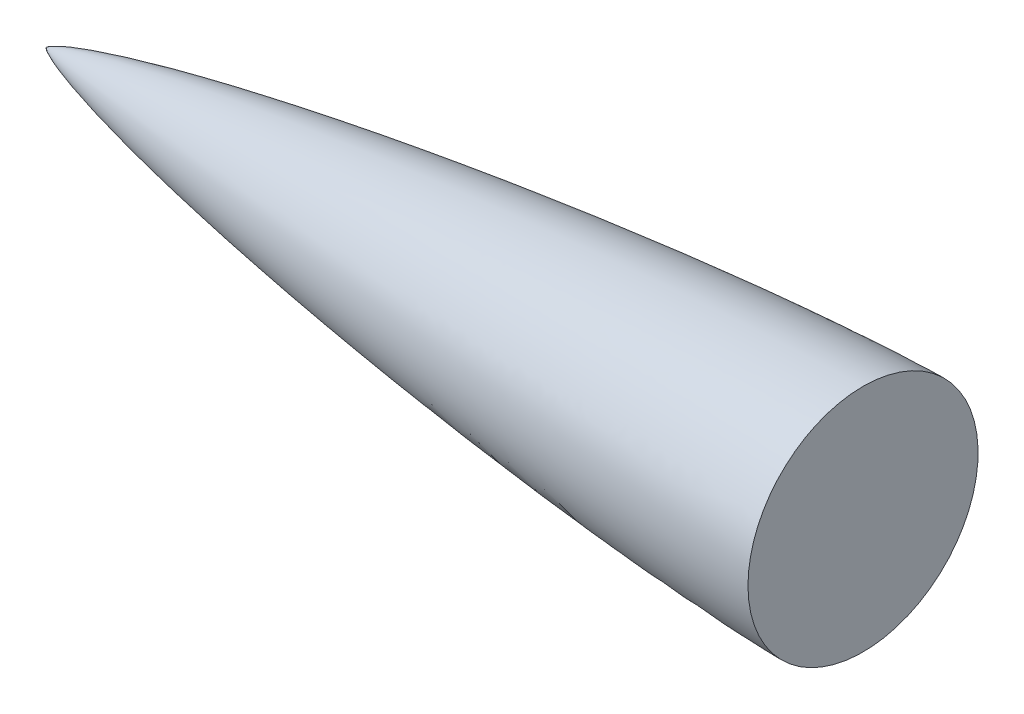
ISO-10303-21;
HEADER;
FILE_DESCRIPTION(('STEP AP214'),'2;1');
FILE_NAME('part.step','',(''),(''),'','','');
FILE_SCHEMA(('AUTOMOTIVE_DESIGN { 1 0 10303 214 1 1 1 1 }'));
ENDSEC;
DATA;
#1=APPLICATION_CONTEXT('core data for automotive mechanical design processes');
#2=APPLICATION_PROTOCOL_DEFINITION('international standard','automotive_design',2000,#1);
#3=PRODUCT_CONTEXT('',#1,'mechanical');
#4=PRODUCT('Part','Part','',(#3));
#5=PRODUCT_RELATED_PRODUCT_CATEGORY('part','',(#4));
#6=PRODUCT_DEFINITION_FORMATION('','',#4);
#7=PRODUCT_DEFINITION_CONTEXT('part definition',#1,'design');
#8=PRODUCT_DEFINITION('design','',#6,#7);
#9=PRODUCT_DEFINITION_SHAPE('','',#8);
#10=(LENGTH_UNIT() NAMED_UNIT(*) SI_UNIT(.MILLI.,.METRE.));
#11=(NAMED_UNIT(*) PLANE_ANGLE_UNIT() SI_UNIT($,.RADIAN.));
#12=(NAMED_UNIT(*) SI_UNIT($,.STERADIAN.) SOLID_ANGLE_UNIT());
#13=UNCERTAINTY_MEASURE_WITH_UNIT(LENGTH_MEASURE(1.E-05),#10,'distance_accuracy_value','');
#14=(GEOMETRIC_REPRESENTATION_CONTEXT(3) GLOBAL_UNCERTAINTY_ASSIGNED_CONTEXT((#13)) GLOBAL_UNIT_ASSIGNED_CONTEXT((#10,
#11,#12)) REPRESENTATION_CONTEXT('',''));
#15=CARTESIAN_POINT('',(0.,0.,0.));
#16=DIRECTION('',(0.,0.,1.));
#17=DIRECTION('',(1.,0.,0.));
#18=AXIS2_PLACEMENT_3D('',#15,#16,#17);
#19=CARTESIAN_POINT('',(600.,84.5,0.));
#20=CARTESIAN_POINT('',(598.165584185935,84.4938415164136,0.));
#21=CARTESIAN_POINT('',(594.496994015842,84.4461282785695,0.));
#22=CARTESIAN_POINT('',(587.160763407665,84.297090638394,0.));
#23=CARTESIAN_POINT('',(575.094746846417,83.9278612048282,0.));
#24=CARTESIAN_POINT('',(560.1358737518,83.3235857042533,0.));
#25=CARTESIAN_POINT('',(537.559805467058,82.1938462678629,0.));
#26=CARTESIAN_POINT('',(509.209738341301,80.4542708329487,0.));
#27=CARTESIAN_POINT('',(476.159975057537,78.0464788400487,0.));
#28=CARTESIAN_POINT('',(438.423758914313,74.8534760480056,0.));
#29=CARTESIAN_POINT('',(400.723448557223,71.2625472713867,0.));
#30=CARTESIAN_POINT('',(363.060742490498,67.2970094705977,0.));
#31=CARTESIAN_POINT('',(325.438230039248,62.9669029979174,0.));
#32=CARTESIAN_POINT('',(287.859557225636,58.2712511891984,0.));
#33=CARTESIAN_POINT('',(250.32992885034,53.1981714415359,0.));
#34=CARTESIAN_POINT('',(212.856624159225,47.7235818225241,0.));
#35=CARTESIAN_POINT('',(175.450520806969,41.8061444202272,0.));
#36=CARTESIAN_POINT('',(138.128029680426,35.3797985298991,0.));
#37=CARTESIAN_POINT('',(105.660510072764,29.2304146350254,0.));
#38=CARTESIAN_POINT('',(78.0370848533098,23.4708559677076,0.));
#39=CARTESIAN_POINT('',(55.1523073616514,18.204296208707,0.));
#40=CARTESIAN_POINT('',(38.4447658864144,13.9892215517046,0.));
#41=CARTESIAN_POINT('',(24.5738097937814,10.0731353044371,0.));
#42=CARTESIAN_POINT('',(14.3260073198311,6.74646690684397,0.));
#43=CARTESIAN_POINT('',(8.13776796226274,4.41786321330721,0.));
#44=CARTESIAN_POINT('',(4.71198257721685,2.93120639805923,0.));
#45=CARTESIAN_POINT('',(2.82602749465674,1.9961280680534,0.));
#46=CARTESIAN_POINT('',(1.75029221351679,1.3922495279907,0.));
#47=CARTESIAN_POINT('',(1.15284253294602,1.0157992419533,0.));
#48=CARTESIAN_POINT('',(0.814117414063319,0.780975633448793,0.));
#49=CARTESIAN_POINT('',(0.566521252025276,0.595358113161637,0.));
#50=CARTESIAN_POINT('',(0.406372153212872,0.465444665324781,0.));
#51=CARTESIAN_POINT('',(0.266057899785584,0.340389673725654,0.));
#52=CARTESIAN_POINT('',(0.14810360798297,0.218754829010574,0.));
#53=CARTESIAN_POINT('',(0.0872682951909874,0.148177126717583,0.));
#54=CARTESIAN_POINT('',(0.0437998913011345,0.0892384587506002,0.));
#55=CARTESIAN_POINT('',(0.0164367810391269,0.0434778199284496,0.));
#56=CARTESIAN_POINT('',(0.00537616912808666,0.0192423519426323,0.));
#57=CARTESIAN_POINT('',(0.00153162016903109,0.00651085708063475,0.));
#58=CARTESIAN_POINT('',(0.,0.,0.));
#59=B_SPLINE_CURVE_WITH_KNOTS('',4,(#19,#20,#21,#22,#23,#24,#25,#26,#27,#28,#29,#30,#31,#32,#33,
#34,#35,#36,#37,#38,#39,#40,#41,#42,#43,#44,#45,#46,#47,#48,#49,#50,#51,#52,#53,#54,#55,#56,#57,
#58),.UNSPECIFIED.,.F.,.F.,(5,1,1,1,1,1,1,1,1,1,1,1,1,1,1,1,1,1,1,1,1,1,1,1,1,1,1,1,1,1,1,1,1,1,
1,1,5),(0.,0.0120695928625244,0.0241391857250488,0.0482783714500976,0.0794244663364488,
0.1105705612228,0.172862752244458,0.235154940687296,0.297447130540996,0.359739320191179,
0.422031509942176,0.484323698674101,0.546615889527493,0.60890807948177,0.67120026771033,
0.733492456971009,0.795784648845318,0.858076826965473,0.888606919448217,0.91913701193096,
0.950283087906691,0.971438373716216,0.98341976507578,0.990005064632344,0.993770144600091,
0.995999603283828,0.997264217787763,0.998118456578253,0.998414570979471,0.998710685380689,
0.999299932990435,0.999474949742826,0.999649966495218,0.999824983247609,0.999912491623804,
0.999956245811902,1.),.UNSPECIFIED.);
#60=CARTESIAN_POINT('',(0.,0.,0.));
#61=DIRECTION('',(-1.,0.,0.));
#62=AXIS1_PLACEMENT('',#60,#61);
#63=SURFACE_OF_REVOLUTION('',#59,#62);
#64=CARTESIAN_POINT('',(0.,0.,0.));
#65=VERTEX_POINT('',#64);
#66=VERTEX_LOOP('',#65);
#67=FACE_BOUND('',#66,.T.);
#68=CARTESIAN_POINT('',(600.,0.,0.));
#69=DIRECTION('',(-1.,0.,0.));
#70=DIRECTION('',(0.,0.,1.));
#71=AXIS2_PLACEMENT_3D('',#68,#69,#70);
#72=CIRCLE('',#71,84.5);
#73=CARTESIAN_POINT('',(600.,0.,84.5));
#74=VERTEX_POINT('',#73);
#75=EDGE_CURVE('E11',#74,#74,#72,.T.);
#76=ORIENTED_EDGE('',*,*,#75,.T.);
#77=EDGE_LOOP('',(#76));
#78=FACE_BOUND('',#77,.T.);
#79=ADVANCED_FACE('F33',(#67,#78),#63,.T.);
#80=CARTESIAN_POINT('',(600.,0.,0.));
#81=DIRECTION('',(-1.,0.,0.));
#82=DIRECTION('',(0.,0.,1.));
#83=AXIS2_PLACEMENT_3D('',#80,#81,#82);
#84=PLANE('',#83);
#85=ORIENTED_EDGE('',*,*,#75,.F.);
#86=EDGE_LOOP('',(#85));
#87=FACE_BOUND('',#86,.T.);
#88=ADVANCED_FACE('F43',(#87),#84,.F.);
#89=CLOSED_SHELL('',(#79,#88));
#90=MANIFOLD_SOLID_BREP('B2',#89);
#91=ADVANCED_BREP_SHAPE_REPRESENTATION('',(#18,#90),#14);
#92=SHAPE_DEFINITION_REPRESENTATION(#9,#91);
ENDSEC;
END-ISO-10303-21;
